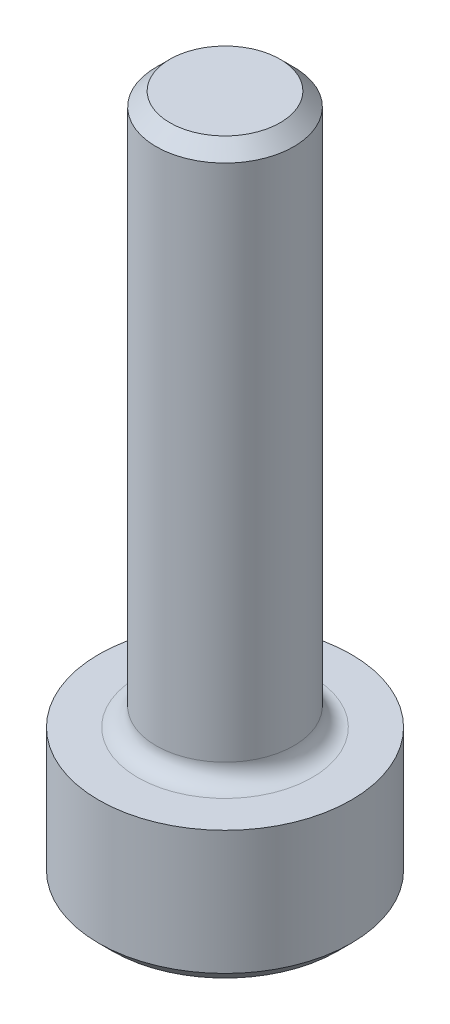
ISO-10303-21;
HEADER;
FILE_DESCRIPTION(('STEP AP214'),'2;1');
FILE_NAME('part.step','',(''),(''),'','','');
FILE_SCHEMA(('AUTOMOTIVE_DESIGN { 1 0 10303 214 1 1 1 1 }'));
ENDSEC;
DATA;
#1=APPLICATION_CONTEXT('core data for automotive mechanical design processes');
#2=APPLICATION_PROTOCOL_DEFINITION('international standard','automotive_design',2000,#1);
#3=PRODUCT_CONTEXT('',#1,'mechanical');
#4=PRODUCT('Part','Part','',(#3));
#5=PRODUCT_RELATED_PRODUCT_CATEGORY('part','',(#4));
#6=PRODUCT_DEFINITION_FORMATION('','',#4);
#7=PRODUCT_DEFINITION_CONTEXT('part definition',#1,'design');
#8=PRODUCT_DEFINITION('design','',#6,#7);
#9=PRODUCT_DEFINITION_SHAPE('','',#8);
#10=(LENGTH_UNIT() NAMED_UNIT(*) SI_UNIT(.MILLI.,.METRE.));
#11=(NAMED_UNIT(*) PLANE_ANGLE_UNIT() SI_UNIT($,.RADIAN.));
#12=(NAMED_UNIT(*) SI_UNIT($,.STERADIAN.) SOLID_ANGLE_UNIT());
#13=UNCERTAINTY_MEASURE_WITH_UNIT(LENGTH_MEASURE(1.E-05),#10,'distance_accuracy_value','');
#14=(GEOMETRIC_REPRESENTATION_CONTEXT(3) GLOBAL_UNCERTAINTY_ASSIGNED_CONTEXT((#13)) GLOBAL_UNIT_ASSIGNED_CONTEXT((#10,
#11,#12)) REPRESENTATION_CONTEXT('',''));
#15=CARTESIAN_POINT('',(0.,0.,0.));
#16=DIRECTION('',(0.,0.,1.));
#17=DIRECTION('',(1.,0.,0.));
#18=AXIS2_PLACEMENT_3D('',#15,#16,#17);
#19=CARTESIAN_POINT('',(0.,12.,0.));
#20=DIRECTION('',(0.,-1.,0.));
#21=DIRECTION('',(0.,0.,-1.));
#22=AXIS2_PLACEMENT_3D('',#19,#20,#21);
#23=CYLINDRICAL_SURFACE('',#22,1.5);
#24=CARTESIAN_POINT('',(0.,11.7,0.));
#25=DIRECTION('',(0.,1.,0.));
#26=DIRECTION('',(0.,0.,1.));
#27=AXIS2_PLACEMENT_3D('',#24,#25,#26);
#28=CIRCLE('',#27,1.5);
#29=CARTESIAN_POINT('',(0.,11.7,1.5));
#30=VERTEX_POINT('',#29);
#31=EDGE_CURVE('E11',#30,#30,#28,.F.);
#32=ORIENTED_EDGE('',*,*,#31,.T.);
#33=EDGE_LOOP('',(#32));
#34=FACE_BOUND('',#33,.T.);
#35=CARTESIAN_POINT('',(0.,0.399999999999999,0.));
#36=DIRECTION('',(0.,1.,0.));
#37=DIRECTION('',(0.,0.,1.));
#38=AXIS2_PLACEMENT_3D('',#35,#36,#37);
#39=CIRCLE('',#38,1.5);
#40=CARTESIAN_POINT('',(0.,0.399999999999999,1.5));
#41=VERTEX_POINT('',#40);
#42=EDGE_CURVE('E143',#41,#41,#39,.T.);
#43=ORIENTED_EDGE('',*,*,#42,.T.);
#44=EDGE_LOOP('',(#43));
#45=FACE_BOUND('',#44,.T.);
#46=ADVANCED_FACE('F33',(#34,#45),#23,.T.);
#47=CARTESIAN_POINT('',(0.,12.,0.));
#48=DIRECTION('',(0.,1.,0.));
#49=DIRECTION('',(0.,0.,1.));
#50=AXIS2_PLACEMENT_3D('',#47,#48,#49);
#51=PLANE('',#50);
#52=CARTESIAN_POINT('',(0.,12.,0.));
#53=DIRECTION('',(0.,1.,0.));
#54=DIRECTION('',(0.,0.,1.));
#55=AXIS2_PLACEMENT_3D('',#52,#53,#54);
#56=CIRCLE('',#55,1.2);
#57=CARTESIAN_POINT('',(0.,12.,1.2));
#58=VERTEX_POINT('',#57);
#59=EDGE_CURVE('E41',#58,#58,#56,.T.);
#60=ORIENTED_EDGE('',*,*,#59,.T.);
#61=EDGE_LOOP('',(#60));
#62=FACE_BOUND('',#61,.T.);
#63=ADVANCED_FACE('F157',(#62),#51,.T.);
#64=CARTESIAN_POINT('',(0.,-3.,0.));
#65=DIRECTION('',(0.,1.,0.));
#66=DIRECTION('',(0.,0.,1.));
#67=AXIS2_PLACEMENT_3D('',#64,#65,#66);
#68=CYLINDRICAL_SURFACE('',#67,2.75);
#69=CARTESIAN_POINT('',(0.,-2.7,0.));
#70=DIRECTION('',(0.,1.,0.));
#71=DIRECTION('',(0.,0.,1.));
#72=AXIS2_PLACEMENT_3D('',#69,#70,#71);
#73=CIRCLE('',#72,2.75);
#74=CARTESIAN_POINT('',(0.,-2.7,2.75));
#75=VERTEX_POINT('',#74);
#76=EDGE_CURVE('E149',#75,#75,#73,.T.);
#77=ORIENTED_EDGE('',*,*,#76,.T.);
#78=EDGE_LOOP('',(#77));
#79=FACE_BOUND('',#78,.T.);
#80=CARTESIAN_POINT('',(0.,0.,0.));
#81=DIRECTION('',(0.,1.,0.));
#82=DIRECTION('',(0.,0.,1.));
#83=AXIS2_PLACEMENT_3D('',#80,#81,#82);
#84=CIRCLE('',#83,2.75);
#85=CARTESIAN_POINT('',(0.,0.,2.75));
#86=VERTEX_POINT('',#85);
#87=EDGE_CURVE('E135',#86,#86,#84,.T.);
#88=ORIENTED_EDGE('',*,*,#87,.F.);
#89=EDGE_LOOP('',(#88));
#90=FACE_BOUND('',#89,.T.);
#91=ADVANCED_FACE('F178',(#79,#90),#68,.T.);
#92=CARTESIAN_POINT('',(0.,-3.,0.));
#93=DIRECTION('',(0.,1.,0.));
#94=DIRECTION('',(0.,0.,1.));
#95=AXIS2_PLACEMENT_3D('',#92,#93,#94);
#96=PLANE('',#95);
#97=DIRECTION('',(-0.866025403784439,0.,-0.5));
#98=VECTOR('',#97,1.);
#99=CARTESIAN_POINT('',(0.,-3.,1.44337567297406));
#100=LINE('',#99,#98);
#101=CARTESIAN_POINT('',(0.,-3.,1.44337567297406));
#102=VERTEX_POINT('',#101);
#103=CARTESIAN_POINT('',(-1.25,-3.,0.721687836487032));
#104=VERTEX_POINT('',#103);
#105=EDGE_CURVE('E122',#102,#104,#100,.T.);
#106=ORIENTED_EDGE('',*,*,#105,.F.);
#107=DIRECTION('',(-0.866025403784439,0.,0.5));
#108=VECTOR('',#107,1.);
#109=CARTESIAN_POINT('',(1.25,-3.,0.721687836487033));
#110=LINE('',#109,#108);
#111=CARTESIAN_POINT('',(1.25,-3.,0.721687836487033));
#112=VERTEX_POINT('',#111);
#113=EDGE_CURVE('E48',#112,#102,#110,.T.);
#114=ORIENTED_EDGE('',*,*,#113,.F.);
#115=DIRECTION('',(0.,0.,1.));
#116=VECTOR('',#115,1.);
#117=CARTESIAN_POINT('',(1.25,-3.,-0.721687836487033));
#118=LINE('',#117,#116);
#119=CARTESIAN_POINT('',(1.25,-3.,-0.721687836487033));
#120=VERTEX_POINT('',#119);
#121=EDGE_CURVE('E131',#120,#112,#118,.T.);
#122=ORIENTED_EDGE('',*,*,#121,.F.);
#123=DIRECTION('',(0.866025403784439,0.,0.5));
#124=VECTOR('',#123,1.);
#125=CARTESIAN_POINT('',(0.,-3.,-1.44337567297406));
#126=LINE('',#125,#124);
#127=CARTESIAN_POINT('',(0.,-3.,-1.44337567297406));
#128=VERTEX_POINT('',#127);
#129=EDGE_CURVE('E129',#128,#120,#126,.T.);
#130=ORIENTED_EDGE('',*,*,#129,.F.);
#131=DIRECTION('',(0.866025403784439,0.,-0.5));
#132=VECTOR('',#131,1.);
#133=CARTESIAN_POINT('',(-1.25,-3.,-0.721687836487033));
#134=LINE('',#133,#132);
#135=CARTESIAN_POINT('',(-1.25,-3.,-0.721687836487033));
#136=VERTEX_POINT('',#135);
#137=EDGE_CURVE('E96',#136,#128,#134,.T.);
#138=ORIENTED_EDGE('',*,*,#137,.F.);
#139=DIRECTION('',(0.,0.,-1.));
#140=VECTOR('',#139,1.);
#141=CARTESIAN_POINT('',(-1.25,-3.,0.721687836487032));
#142=LINE('',#141,#140);
#143=EDGE_CURVE('E125',#104,#136,#142,.T.);
#144=ORIENTED_EDGE('',*,*,#143,.F.);
#145=EDGE_LOOP('',(#106,#114,#122,#130,#138,#144));
#146=FACE_BOUND('',#145,.T.);
#147=CARTESIAN_POINT('',(0.,-3.,0.));
#148=DIRECTION('',(0.,1.,0.));
#149=DIRECTION('',(0.,0.,1.));
#150=AXIS2_PLACEMENT_3D('',#147,#148,#149);
#151=CIRCLE('',#150,2.45);
#152=CARTESIAN_POINT('',(0.,-3.,2.45));
#153=VERTEX_POINT('',#152);
#154=EDGE_CURVE('E152',#153,#153,#151,.F.);
#155=ORIENTED_EDGE('',*,*,#154,.T.);
#156=EDGE_LOOP('',(#155));
#157=FACE_BOUND('',#156,.T.);
#158=ADVANCED_FACE('F189',(#146,#157),#96,.F.);
#159=CARTESIAN_POINT('',(0.,0.,0.));
#160=DIRECTION('',(0.,1.,0.));
#161=DIRECTION('',(0.,0.,1.));
#162=AXIS2_PLACEMENT_3D('',#159,#160,#161);
#163=PLANE('',#162);
#164=CARTESIAN_POINT('',(0.,0.,0.));
#165=DIRECTION('',(0.,1.,0.));
#166=DIRECTION('',(0.,0.,1.));
#167=AXIS2_PLACEMENT_3D('',#164,#165,#166);
#168=CIRCLE('',#167,1.9);
#169=CARTESIAN_POINT('',(0.,0.,1.9));
#170=VERTEX_POINT('',#169);
#171=EDGE_CURVE('E146',#170,#170,#168,.F.);
#172=ORIENTED_EDGE('',*,*,#171,.T.);
#173=EDGE_LOOP('',(#172));
#174=FACE_BOUND('',#173,.T.);
#175=ORIENTED_EDGE('',*,*,#87,.T.);
#176=EDGE_LOOP('',(#175));
#177=FACE_BOUND('',#176,.T.);
#178=ADVANCED_FACE('F184',(#174,#177),#163,.T.);
#179=CARTESIAN_POINT('',(0.,0.399999999999999,0.));
#180=DIRECTION('',(0.,1.,0.));
#181=DIRECTION('',(0.,0.,1.));
#182=AXIS2_PLACEMENT_3D('',#179,#180,#181);
#183=TOROIDAL_SURFACE('',#182,1.9,0.4);
#184=ORIENTED_EDGE('',*,*,#171,.F.);
#185=EDGE_LOOP('',(#184));
#186=FACE_BOUND('',#185,.T.);
#187=ORIENTED_EDGE('',*,*,#42,.F.);
#188=EDGE_LOOP('',(#187));
#189=FACE_BOUND('',#188,.T.);
#190=ADVANCED_FACE('F169',(#186,#189),#183,.F.);
#191=CARTESIAN_POINT('',(0.,-2.7,0.));
#192=DIRECTION('',(0.,1.,0.));
#193=DIRECTION('',(0.,0.,1.));
#194=AXIS2_PLACEMENT_3D('',#191,#192,#193);
#195=CONICAL_SURFACE('',#194,2.75,0.78539816339745);
#196=ORIENTED_EDGE('',*,*,#154,.F.);
#197=EDGE_LOOP('',(#196));
#198=FACE_BOUND('',#197,.T.);
#199=ORIENTED_EDGE('',*,*,#76,.F.);
#200=EDGE_LOOP('',(#199));
#201=FACE_BOUND('',#200,.T.);
#202=ADVANCED_FACE('F161',(#198,#201),#195,.T.);
#203=CARTESIAN_POINT('',(0.,12.,0.));
#204=DIRECTION('',(0.,-1.,0.));
#205=DIRECTION('',(0.,0.,-1.));
#206=AXIS2_PLACEMENT_3D('',#203,#204,#205);
#207=CONICAL_SURFACE('',#206,1.2,0.785398163397447);
#208=ORIENTED_EDGE('',*,*,#31,.F.);
#209=EDGE_LOOP('',(#208));
#210=FACE_BOUND('',#209,.T.);
#211=ORIENTED_EDGE('',*,*,#59,.F.);
#212=EDGE_LOOP('',(#211));
#213=FACE_BOUND('',#212,.T.);
#214=ADVANCED_FACE('F35',(#210,#213),#207,.T.);
#215=CARTESIAN_POINT('',(1.25,-0.5,0.721687836487033));
#216=DIRECTION('',(0.5,0.,0.866025403784439));
#217=DIRECTION('',(0.866025403784439,0.,-0.5));
#218=AXIS2_PLACEMENT_3D('',#215,#216,#217);
#219=PLANE('',#218);
#220=ORIENTED_EDGE('',*,*,#113,.T.);
#221=DIRECTION('',(0.,-1.,0.));
#222=VECTOR('',#221,1.);
#223=CARTESIAN_POINT('',(0.,-0.5,1.44337567297406));
#224=LINE('',#223,#222);
#225=CARTESIAN_POINT('',(0.,-0.5,1.44337567297406));
#226=VERTEX_POINT('',#225);
#227=EDGE_CURVE('E78',#226,#102,#224,.T.);
#228=ORIENTED_EDGE('',*,*,#227,.F.);
#229=DIRECTION('',(-0.866025403784439,0.,0.5));
#230=VECTOR('',#229,1.);
#231=CARTESIAN_POINT('',(1.25,-0.5,0.721687836487033));
#232=LINE('',#231,#230);
#233=CARTESIAN_POINT('',(1.25,-0.5,0.721687836487033));
#234=VERTEX_POINT('',#233);
#235=EDGE_CURVE('E133',#234,#226,#232,.T.);
#236=ORIENTED_EDGE('',*,*,#235,.F.);
#237=DIRECTION('',(0.,-1.,0.));
#238=VECTOR('',#237,1.);
#239=CARTESIAN_POINT('',(1.25,-0.5,0.721687836487033));
#240=LINE('',#239,#238);
#241=EDGE_CURVE('E56',#234,#112,#240,.T.);
#242=ORIENTED_EDGE('',*,*,#241,.T.);
#243=EDGE_LOOP('',(#220,#228,#236,#242));
#244=FACE_BOUND('',#243,.T.);
#245=ADVANCED_FACE('F160',(#244),#219,.F.);
#246=CARTESIAN_POINT('',(1.25,-0.5,-0.721687836487033));
#247=DIRECTION('',(1.,0.,0.));
#248=DIRECTION('',(0.,0.,-1.));
#249=AXIS2_PLACEMENT_3D('',#246,#247,#248);
#250=PLANE('',#249);
#251=ORIENTED_EDGE('',*,*,#121,.T.);
#252=ORIENTED_EDGE('',*,*,#241,.F.);
#253=DIRECTION('',(0.,0.,1.));
#254=VECTOR('',#253,1.);
#255=CARTESIAN_POINT('',(1.25,-0.5,-0.721687836487033));
#256=LINE('',#255,#254);
#257=CARTESIAN_POINT('',(1.25,-0.5,-0.721687836487033));
#258=VERTEX_POINT('',#257);
#259=EDGE_CURVE('E108',#258,#234,#256,.T.);
#260=ORIENTED_EDGE('',*,*,#259,.F.);
#261=DIRECTION('',(0.,-1.,0.));
#262=VECTOR('',#261,1.);
#263=CARTESIAN_POINT('',(1.25,-0.5,-0.721687836487033));
#264=LINE('',#263,#262);
#265=EDGE_CURVE('E100',#258,#120,#264,.T.);
#266=ORIENTED_EDGE('',*,*,#265,.T.);
#267=EDGE_LOOP('',(#251,#252,#260,#266));
#268=FACE_BOUND('',#267,.T.);
#269=ADVANCED_FACE('F167',(#268),#250,.F.);
#270=CARTESIAN_POINT('',(0.,-0.5,-1.44337567297406));
#271=DIRECTION('',(0.5,0.,-0.866025403784439));
#272=DIRECTION('',(-0.866025403784439,0.,-0.5));
#273=AXIS2_PLACEMENT_3D('',#270,#271,#272);
#274=PLANE('',#273);
#275=ORIENTED_EDGE('',*,*,#129,.T.);
#276=ORIENTED_EDGE('',*,*,#265,.F.);
#277=DIRECTION('',(0.866025403784439,0.,0.5));
#278=VECTOR('',#277,1.);
#279=CARTESIAN_POINT('',(0.,-0.5,-1.44337567297406));
#280=LINE('',#279,#278);
#281=CARTESIAN_POINT('',(0.,-0.5,-1.44337567297406));
#282=VERTEX_POINT('',#281);
#283=EDGE_CURVE('E104',#282,#258,#280,.T.);
#284=ORIENTED_EDGE('',*,*,#283,.F.);
#285=DIRECTION('',(0.,-1.,0.));
#286=VECTOR('',#285,1.);
#287=CARTESIAN_POINT('',(0.,-0.5,-1.44337567297406));
#288=LINE('',#287,#286);
#289=EDGE_CURVE('E89',#282,#128,#288,.T.);
#290=ORIENTED_EDGE('',*,*,#289,.T.);
#291=EDGE_LOOP('',(#275,#276,#284,#290));
#292=FACE_BOUND('',#291,.T.);
#293=ADVANCED_FACE('F105',(#292),#274,.F.);
#294=CARTESIAN_POINT('',(-1.25,-0.5,-0.721687836487033));
#295=DIRECTION('',(-0.5,0.,-0.866025403784439));
#296=DIRECTION('',(-0.866025403784439,0.,0.5));
#297=AXIS2_PLACEMENT_3D('',#294,#295,#296);
#298=PLANE('',#297);
#299=ORIENTED_EDGE('',*,*,#137,.T.);
#300=ORIENTED_EDGE('',*,*,#289,.F.);
#301=DIRECTION('',(0.866025403784439,0.,-0.5));
#302=VECTOR('',#301,1.);
#303=CARTESIAN_POINT('',(-1.25,-0.5,-0.721687836487033));
#304=LINE('',#303,#302);
#305=CARTESIAN_POINT('',(-1.25,-0.5,-0.721687836487033));
#306=VERTEX_POINT('',#305);
#307=EDGE_CURVE('E93',#306,#282,#304,.T.);
#308=ORIENTED_EDGE('',*,*,#307,.F.);
#309=DIRECTION('',(0.,-1.,0.));
#310=VECTOR('',#309,1.);
#311=CARTESIAN_POINT('',(-1.25,-0.5,-0.721687836487033));
#312=LINE('',#311,#310);
#313=EDGE_CURVE('E101',#306,#136,#312,.T.);
#314=ORIENTED_EDGE('',*,*,#313,.T.);
#315=EDGE_LOOP('',(#299,#300,#308,#314));
#316=FACE_BOUND('',#315,.T.);
#317=ADVANCED_FACE('F91',(#316),#298,.F.);
#318=CARTESIAN_POINT('',(-1.25,-0.5,0.721687836487032));
#319=DIRECTION('',(-1.,0.,0.));
#320=DIRECTION('',(0.,0.,1.));
#321=AXIS2_PLACEMENT_3D('',#318,#319,#320);
#322=PLANE('',#321);
#323=ORIENTED_EDGE('',*,*,#143,.T.);
#324=ORIENTED_EDGE('',*,*,#313,.F.);
#325=DIRECTION('',(0.,0.,-1.));
#326=VECTOR('',#325,1.);
#327=CARTESIAN_POINT('',(-1.25,-0.5,0.721687836487032));
#328=LINE('',#327,#326);
#329=CARTESIAN_POINT('',(-1.25,-0.5,0.721687836487032));
#330=VERTEX_POINT('',#329);
#331=EDGE_CURVE('E114',#330,#306,#328,.T.);
#332=ORIENTED_EDGE('',*,*,#331,.F.);
#333=DIRECTION('',(0.,-1.,0.));
#334=VECTOR('',#333,1.);
#335=CARTESIAN_POINT('',(-1.25,-0.5,0.721687836487032));
#336=LINE('',#335,#334);
#337=EDGE_CURVE('E138',#330,#104,#336,.T.);
#338=ORIENTED_EDGE('',*,*,#337,.T.);
#339=EDGE_LOOP('',(#323,#324,#332,#338));
#340=FACE_BOUND('',#339,.T.);
#341=ADVANCED_FACE('F209',(#340),#322,.F.);
#342=CARTESIAN_POINT('',(0.,-0.5,1.44337567297406));
#343=DIRECTION('',(-0.5,0.,0.866025403784439));
#344=DIRECTION('',(0.866025403784439,0.,0.5));
#345=AXIS2_PLACEMENT_3D('',#342,#343,#344);
#346=PLANE('',#345);
#347=ORIENTED_EDGE('',*,*,#105,.T.);
#348=ORIENTED_EDGE('',*,*,#337,.F.);
#349=DIRECTION('',(-0.866025403784439,0.,-0.5));
#350=VECTOR('',#349,1.);
#351=CARTESIAN_POINT('',(0.,-0.5,1.44337567297406));
#352=LINE('',#351,#350);
#353=EDGE_CURVE('E116',#226,#330,#352,.T.);
#354=ORIENTED_EDGE('',*,*,#353,.F.);
#355=ORIENTED_EDGE('',*,*,#227,.T.);
#356=EDGE_LOOP('',(#347,#348,#354,#355));
#357=FACE_BOUND('',#356,.T.);
#358=ADVANCED_FACE('F206',(#357),#346,.F.);
#359=CARTESIAN_POINT('',(0.,-0.5,0.));
#360=DIRECTION('',(0.,-1.,0.));
#361=DIRECTION('',(0.,0.,-1.));
#362=AXIS2_PLACEMENT_3D('',#359,#360,#361);
#363=PLANE('',#362);
#364=ORIENTED_EDGE('',*,*,#235,.T.);
#365=ORIENTED_EDGE('',*,*,#353,.T.);
#366=ORIENTED_EDGE('',*,*,#331,.T.);
#367=ORIENTED_EDGE('',*,*,#307,.T.);
#368=ORIENTED_EDGE('',*,*,#283,.T.);
#369=ORIENTED_EDGE('',*,*,#259,.T.);
#370=EDGE_LOOP('',(#364,#365,#366,#367,#368,#369));
#371=FACE_BOUND('',#370,.T.);
#372=ADVANCED_FACE('F111',(#371),#363,.T.);
#373=CLOSED_SHELL('',(#46,#63,#91,#158,#178,#190,#202,#214,#245,#269,#293,#317,#341,#358,#372));
#374=MANIFOLD_SOLID_BREP('B2',#373);
#375=ADVANCED_BREP_SHAPE_REPRESENTATION('',(#18,#374),#14);
#376=SHAPE_DEFINITION_REPRESENTATION(#9,#375);
ENDSEC;
END-ISO-10303-21;
